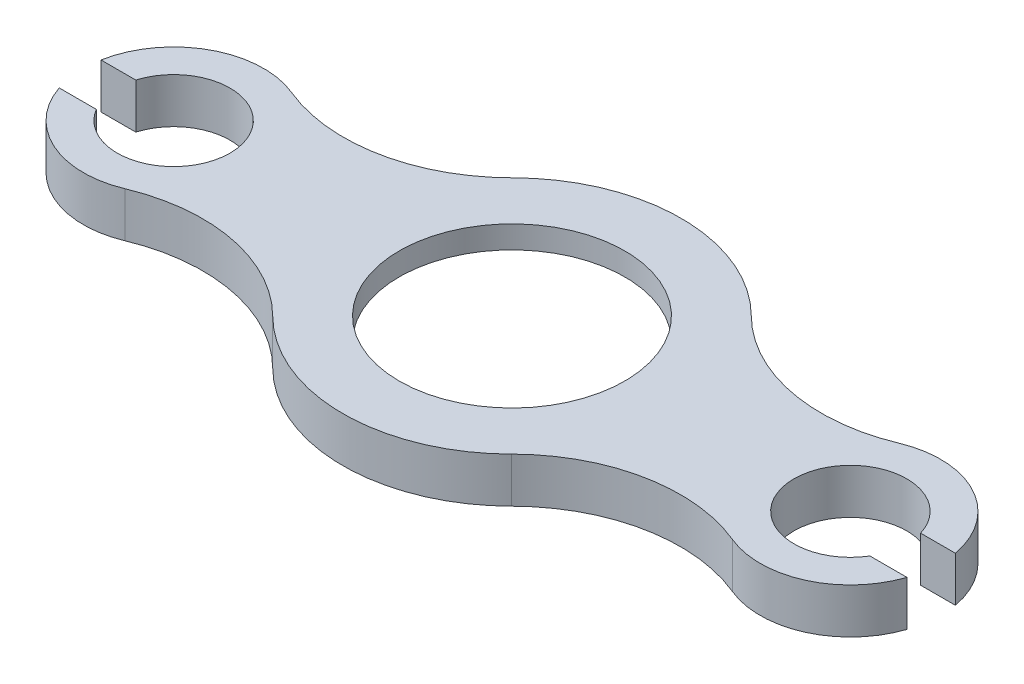
ISO-10303-21;
HEADER;
FILE_DESCRIPTION(('STEP AP214'),'2;1');
FILE_NAME('part.step','',(''),(''),'','','');
FILE_SCHEMA(('AUTOMOTIVE_DESIGN { 1 0 10303 214 1 1 1 1 }'));
ENDSEC;
DATA;
#1=APPLICATION_CONTEXT('core data for automotive mechanical design processes');
#2=APPLICATION_PROTOCOL_DEFINITION('international standard','automotive_design',2000,#1);
#3=PRODUCT_CONTEXT('',#1,'mechanical');
#4=PRODUCT('Part','Part','',(#3));
#5=PRODUCT_RELATED_PRODUCT_CATEGORY('part','',(#4));
#6=PRODUCT_DEFINITION_FORMATION('','',#4);
#7=PRODUCT_DEFINITION_CONTEXT('part definition',#1,'design');
#8=PRODUCT_DEFINITION('design','',#6,#7);
#9=PRODUCT_DEFINITION_SHAPE('','',#8);
#10=(LENGTH_UNIT() NAMED_UNIT(*) SI_UNIT(.MILLI.,.METRE.));
#11=(NAMED_UNIT(*) PLANE_ANGLE_UNIT() SI_UNIT($,.RADIAN.));
#12=(NAMED_UNIT(*) SI_UNIT($,.STERADIAN.) SOLID_ANGLE_UNIT());
#13=UNCERTAINTY_MEASURE_WITH_UNIT(LENGTH_MEASURE(1.E-05),#10,'distance_accuracy_value','');
#14=(GEOMETRIC_REPRESENTATION_CONTEXT(3) GLOBAL_UNCERTAINTY_ASSIGNED_CONTEXT((#13)) GLOBAL_UNIT_ASSIGNED_CONTEXT((#10,
#11,#12)) REPRESENTATION_CONTEXT('',''));
#15=CARTESIAN_POINT('',(0.,0.,0.));
#16=DIRECTION('',(0.,0.,1.));
#17=DIRECTION('',(1.,0.,0.));
#18=AXIS2_PLACEMENT_3D('',#15,#16,#17);
#19=CARTESIAN_POINT('',(150.,20.,0.));
#20=DIRECTION('',(0.,-1.,0.));
#21=DIRECTION('',(0.,0.,-1.));
#22=AXIS2_PLACEMENT_3D('',#19,#20,#21);
#23=CYLINDRICAL_SURFACE('',#22,40.);
#24=CARTESIAN_POINT('',(150.,20.,0.));
#25=DIRECTION('',(0.,1.,0.));
#26=DIRECTION('',(0.,0.,1.));
#27=AXIS2_PLACEMENT_3D('',#24,#25,#26);
#28=CIRCLE('',#27,40.);
#29=CARTESIAN_POINT('',(189.349681891084,20.,-7.18349045175815));
#30=VERTEX_POINT('',#29);
#31=CARTESIAN_POINT('',(134.666666666667,20.,-36.9444026733264));
#32=VERTEX_POINT('',#31);
#33=EDGE_CURVE('E289',#30,#32,#28,.T.);
#34=ORIENTED_EDGE('',*,*,#33,.F.);
#35=DIRECTION('',(0.,-1.,0.));
#36=VECTOR('',#35,1.);
#37=CARTESIAN_POINT('',(189.349681891084,20.,-7.18349045175815));
#38=LINE('',#37,#36);
#39=CARTESIAN_POINT('',(189.349681891084,0.,-7.18349045175815));
#40=VERTEX_POINT('',#39);
#41=EDGE_CURVE('E382',#30,#40,#38,.T.);
#42=ORIENTED_EDGE('',*,*,#41,.T.);
#43=CARTESIAN_POINT('',(150.,0.,0.));
#44=DIRECTION('',(0.,1.,0.));
#45=DIRECTION('',(0.,0.,1.));
#46=AXIS2_PLACEMENT_3D('',#43,#44,#45);
#47=CIRCLE('',#46,40.);
#48=CARTESIAN_POINT('',(134.666666666667,0.,-36.9444026733264));
#49=VERTEX_POINT('',#48);
#50=EDGE_CURVE('E313',#40,#49,#47,.T.);
#51=ORIENTED_EDGE('',*,*,#50,.T.);
#52=DIRECTION('',(0.,-1.,0.));
#53=VECTOR('',#52,1.);
#54=CARTESIAN_POINT('',(134.666666666667,20.,-36.9444026733264));
#55=LINE('',#54,#53);
#56=EDGE_CURVE('E345',#32,#49,#55,.T.);
#57=ORIENTED_EDGE('',*,*,#56,.F.);
#58=EDGE_LOOP('',(#34,#42,#51,#57));
#59=FACE_BOUND('',#58,.T.);
#60=ADVANCED_FACE('F128',(#59),#23,.T.);
#61=CARTESIAN_POINT('',(-150.,20.,0.));
#62=DIRECTION('',(0.,-1.,0.));
#63=DIRECTION('',(0.,0.,-1.));
#64=AXIS2_PLACEMENT_3D('',#61,#62,#63);
#65=CYLINDRICAL_SURFACE('',#64,40.);
#66=CARTESIAN_POINT('',(-150.,0.,0.));
#67=DIRECTION('',(0.,1.,0.));
#68=DIRECTION('',(0.,0.,1.));
#69=AXIS2_PLACEMENT_3D('',#66,#67,#68);
#70=CIRCLE('',#69,40.);
#71=CARTESIAN_POINT('',(-134.666666666667,0.,-36.9444026733264));
#72=VERTEX_POINT('',#71);
#73=CARTESIAN_POINT('',(-189.349681891084,0.,-7.18349045175815));
#74=VERTEX_POINT('',#73);
#75=EDGE_CURVE('E324',#72,#74,#70,.T.);
#76=ORIENTED_EDGE('',*,*,#75,.T.);
#77=DIRECTION('',(0.,-1.,0.));
#78=VECTOR('',#77,1.);
#79=CARTESIAN_POINT('',(-189.349681891084,20.,-7.18349045175815));
#80=LINE('',#79,#78);
#81=CARTESIAN_POINT('',(-189.349681891084,20.,-7.18349045175815));
#82=VERTEX_POINT('',#81);
#83=EDGE_CURVE('E361',#74,#82,#80,.F.);
#84=ORIENTED_EDGE('',*,*,#83,.T.);
#85=CARTESIAN_POINT('',(-150.,20.,0.));
#86=DIRECTION('',(0.,1.,0.));
#87=DIRECTION('',(0.,0.,1.));
#88=AXIS2_PLACEMENT_3D('',#85,#86,#87);
#89=CIRCLE('',#88,40.);
#90=CARTESIAN_POINT('',(-134.666666666667,20.,-36.9444026733264));
#91=VERTEX_POINT('',#90);
#92=EDGE_CURVE('E302',#91,#82,#89,.T.);
#93=ORIENTED_EDGE('',*,*,#92,.F.);
#94=DIRECTION('',(0.,-1.,0.));
#95=VECTOR('',#94,1.);
#96=CARTESIAN_POINT('',(-134.666666666667,20.,-36.9444026733264));
#97=LINE('',#96,#95);
#98=EDGE_CURVE('E337',#91,#72,#97,.T.);
#99=ORIENTED_EDGE('',*,*,#98,.T.);
#100=EDGE_LOOP('',(#76,#84,#93,#99));
#101=FACE_BOUND('',#100,.T.);
#102=ADVANCED_FACE('F402',(#101),#65,.T.);
#103=CARTESIAN_POINT('',(127.958333333333,20.,53.1075788429067));
#104=DIRECTION('',(0.,-1.,0.));
#105=DIRECTION('',(0.,0.,-1.));
#106=AXIS2_PLACEMENT_3D('',#103,#104,#105);
#107=PLANE('',#106);
#108=CARTESIAN_POINT('',(150.,20.,0.));
#109=DIRECTION('',(0.,1.,0.));
#110=DIRECTION('',(0.,0.,1.));
#111=AXIS2_PLACEMENT_3D('',#108,#109,#110);
#112=CIRCLE('',#111,25.);
#113=CARTESIAN_POINT('',(173.945719135777,20.,-7.18349045175815));
#114=VERTEX_POINT('',#113);
#115=CARTESIAN_POINT('',(171.464787047624,20.,12.8165095482419));
#116=VERTEX_POINT('',#115);
#117=EDGE_CURVE('E277',#114,#116,#112,.T.);
#118=ORIENTED_EDGE('',*,*,#117,.F.);
#119=DIRECTION('',(1.,0.,0.));
#120=VECTOR('',#119,1.);
#121=CARTESIAN_POINT('',(127.958333333333,20.,-7.18349045175815));
#122=LINE('',#121,#120);
#123=EDGE_CURVE('E150',#114,#30,#122,.T.);
#124=ORIENTED_EDGE('',*,*,#123,.T.);
#125=ORIENTED_EDGE('',*,*,#33,.T.);
#126=CARTESIAN_POINT('',(105.916666666667,20.,-106.215157685813));
#127=DIRECTION('',(0.,1.,0.));
#128=DIRECTION('',(0.,0.,1.));
#129=AXIS2_PLACEMENT_3D('',#126,#127,#128);
#130=CIRCLE('',#129,75.);
#131=CARTESIAN_POINT('',(52.9583333333333,20.,-53.1075788429067));
#132=VERTEX_POINT('',#131);
#133=EDGE_CURVE('E294',#132,#32,#130,.T.);
#134=ORIENTED_EDGE('',*,*,#133,.F.);
#135=CARTESIAN_POINT('',(0.,20.,0.));
#136=DIRECTION('',(0.,1.,0.));
#137=DIRECTION('',(0.,0.,1.));
#138=AXIS2_PLACEMENT_3D('',#135,#136,#137);
#139=CIRCLE('',#138,75.);
#140=CARTESIAN_POINT('',(-52.9583333333333,20.,-53.1075788429068));
#141=VERTEX_POINT('',#140);
#142=EDGE_CURVE('E297',#132,#141,#139,.T.);
#143=ORIENTED_EDGE('',*,*,#142,.T.);
#144=CARTESIAN_POINT('',(-105.916666666667,20.,-106.215157685813));
#145=DIRECTION('',(0.,-1.,0.));
#146=DIRECTION('',(0.,0.,-1.));
#147=AXIS2_PLACEMENT_3D('',#144,#145,#146);
#148=CIRCLE('',#147,75.);
#149=EDGE_CURVE('E299',#141,#91,#148,.T.);
#150=ORIENTED_EDGE('',*,*,#149,.T.);
#151=ORIENTED_EDGE('',*,*,#92,.T.);
#152=DIRECTION('',(1.,0.,0.));
#153=VECTOR('',#152,1.);
#154=CARTESIAN_POINT('',(127.958333333333,20.,-7.18349045175815));
#155=LINE('',#154,#153);
#156=CARTESIAN_POINT('',(-173.945719135777,20.,-7.18349045175815));
#157=VERTEX_POINT('',#156);
#158=EDGE_CURVE('E375',#82,#157,#155,.T.);
#159=ORIENTED_EDGE('',*,*,#158,.T.);
#160=CARTESIAN_POINT('',(-150.,20.,0.));
#161=DIRECTION('',(0.,-1.,0.));
#162=DIRECTION('',(0.,0.,-1.));
#163=AXIS2_PLACEMENT_3D('',#160,#161,#162);
#164=CIRCLE('',#163,25.);
#165=CARTESIAN_POINT('',(-171.464787047624,20.,12.8165095482419));
#166=VERTEX_POINT('',#165);
#167=EDGE_CURVE('E267',#157,#166,#164,.T.);
#168=ORIENTED_EDGE('',*,*,#167,.T.);
#169=DIRECTION('',(-1.,0.,0.));
#170=VECTOR('',#169,1.);
#171=CARTESIAN_POINT('',(127.958333333333,20.,12.8165095482419));
#172=LINE('',#171,#170);
#173=CARTESIAN_POINT('',(-187.891121427055,20.,12.8165095482419));
#174=VERTEX_POINT('',#173);
#175=EDGE_CURVE('E245',#166,#174,#172,.T.);
#176=ORIENTED_EDGE('',*,*,#175,.T.);
#177=CARTESIAN_POINT('',(-134.666666666666,20.,36.9444026733264));
#178=VERTEX_POINT('',#177);
#179=EDGE_CURVE('E301',#174,#178,#89,.T.);
#180=ORIENTED_EDGE('',*,*,#179,.T.);
#181=CARTESIAN_POINT('',(-105.916666666666,20.,106.215157685813));
#182=DIRECTION('',(0.,1.,0.));
#183=DIRECTION('',(0.,0.,1.));
#184=AXIS2_PLACEMENT_3D('',#181,#182,#183);
#185=CIRCLE('',#184,75.);
#186=CARTESIAN_POINT('',(-52.9583333333331,20.,53.1075788429067));
#187=VERTEX_POINT('',#186);
#188=EDGE_CURVE('E305',#187,#178,#185,.T.);
#189=ORIENTED_EDGE('',*,*,#188,.F.);
#190=CARTESIAN_POINT('',(0.,20.,0.));
#191=DIRECTION('',(0.,1.,0.));
#192=DIRECTION('',(0.,0.,1.));
#193=AXIS2_PLACEMENT_3D('',#190,#191,#192);
#194=CIRCLE('',#193,74.9999999999998);
#195=CARTESIAN_POINT('',(52.9583333333331,20.,53.1075788429067));
#196=VERTEX_POINT('',#195);
#197=EDGE_CURVE('E308',#187,#196,#194,.T.);
#198=ORIENTED_EDGE('',*,*,#197,.T.);
#199=CARTESIAN_POINT('',(105.916666666666,20.,106.215157685813));
#200=DIRECTION('',(0.,-1.,0.));
#201=DIRECTION('',(0.,0.,-1.));
#202=AXIS2_PLACEMENT_3D('',#199,#200,#201);
#203=CIRCLE('',#202,75.);
#204=CARTESIAN_POINT('',(134.666666666666,20.,36.9444026733264));
#205=VERTEX_POINT('',#204);
#206=EDGE_CURVE('E286',#196,#205,#203,.T.);
#207=ORIENTED_EDGE('',*,*,#206,.T.);
#208=CARTESIAN_POINT('',(187.891121427055,20.,12.8165095482419));
#209=VERTEX_POINT('',#208);
#210=EDGE_CURVE('E291',#205,#209,#28,.T.);
#211=ORIENTED_EDGE('',*,*,#210,.T.);
#212=DIRECTION('',(-1.,0.,0.));
#213=VECTOR('',#212,1.);
#214=CARTESIAN_POINT('',(127.958333333333,20.,12.8165095482419));
#215=LINE('',#214,#213);
#216=EDGE_CURVE('E352',#209,#116,#215,.T.);
#217=ORIENTED_EDGE('',*,*,#216,.T.);
#218=EDGE_LOOP('',(#118,#124,#125,#134,#143,#150,#151,#159,#168,#176,#180,#189,#198,#207,#211,#217));
#219=FACE_BOUND('',#218,.T.);
#220=CARTESIAN_POINT('',(0.,20.,0.));
#221=DIRECTION('',(0.,1.,0.));
#222=DIRECTION('',(0.,0.,1.));
#223=AXIS2_PLACEMENT_3D('',#220,#221,#222);
#224=CIRCLE('',#223,50.);
#225=CARTESIAN_POINT('',(0.,20.,50.));
#226=VERTEX_POINT('',#225);
#227=EDGE_CURVE('E280',#226,#226,#224,.T.);
#228=ORIENTED_EDGE('',*,*,#227,.F.);
#229=EDGE_LOOP('',(#228));
#230=FACE_BOUND('',#229,.T.);
#231=ADVANCED_FACE('F358',(#219,#230),#107,.F.);
#232=CARTESIAN_POINT('',(127.958333333333,0.,53.1075788429067));
#233=DIRECTION('',(0.,-1.,0.));
#234=DIRECTION('',(0.,0.,-1.));
#235=AXIS2_PLACEMENT_3D('',#232,#233,#234);
#236=PLANE('',#235);
#237=DIRECTION('',(1.,0.,0.));
#238=VECTOR('',#237,1.);
#239=CARTESIAN_POINT('',(170.689370017687,0.,-7.18349045175815));
#240=LINE('',#239,#238);
#241=CARTESIAN_POINT('',(173.945719135777,0.,-7.18349045175815));
#242=VERTEX_POINT('',#241);
#243=EDGE_CURVE('E365',#242,#40,#240,.T.);
#244=ORIENTED_EDGE('',*,*,#243,.F.);
#245=CARTESIAN_POINT('',(150.,0.,0.));
#246=DIRECTION('',(0.,1.,0.));
#247=DIRECTION('',(0.,0.,1.));
#248=AXIS2_PLACEMENT_3D('',#245,#246,#247);
#249=CIRCLE('',#248,25.);
#250=CARTESIAN_POINT('',(171.464787047624,0.,12.8165095482419));
#251=VERTEX_POINT('',#250);
#252=EDGE_CURVE('E270',#242,#251,#249,.T.);
#253=ORIENTED_EDGE('',*,*,#252,.T.);
#254=DIRECTION('',(-1.,0.,0.));
#255=VECTOR('',#254,1.);
#256=CARTESIAN_POINT('',(170.689370017687,0.,12.8165095482419));
#257=LINE('',#256,#255);
#258=CARTESIAN_POINT('',(187.891121427055,0.,12.8165095482419));
#259=VERTEX_POINT('',#258);
#260=EDGE_CURVE('E143',#259,#251,#257,.T.);
#261=ORIENTED_EDGE('',*,*,#260,.F.);
#262=CARTESIAN_POINT('',(134.666666666666,0.,36.9444026733264));
#263=VERTEX_POINT('',#262);
#264=EDGE_CURVE('E314',#263,#259,#47,.T.);
#265=ORIENTED_EDGE('',*,*,#264,.F.);
#266=CARTESIAN_POINT('',(105.916666666666,0.,106.215157685813));
#267=DIRECTION('',(0.,-1.,0.));
#268=DIRECTION('',(0.,0.,-1.));
#269=AXIS2_PLACEMENT_3D('',#266,#267,#268);
#270=CIRCLE('',#269,75.);
#271=CARTESIAN_POINT('',(52.9583333333331,0.,53.1075788429067));
#272=VERTEX_POINT('',#271);
#273=EDGE_CURVE('E285',#272,#263,#270,.T.);
#274=ORIENTED_EDGE('',*,*,#273,.F.);
#275=CARTESIAN_POINT('',(0.,0.,0.));
#276=DIRECTION('',(0.,1.,0.));
#277=DIRECTION('',(0.,0.,1.));
#278=AXIS2_PLACEMENT_3D('',#275,#276,#277);
#279=CIRCLE('',#278,74.9999999999998);
#280=CARTESIAN_POINT('',(-52.9583333333331,0.,53.1075788429067));
#281=VERTEX_POINT('',#280);
#282=EDGE_CURVE('E290',#281,#272,#279,.T.);
#283=ORIENTED_EDGE('',*,*,#282,.F.);
#284=CARTESIAN_POINT('',(-105.916666666666,0.,106.215157685813));
#285=DIRECTION('',(0.,1.,0.));
#286=DIRECTION('',(0.,0.,1.));
#287=AXIS2_PLACEMENT_3D('',#284,#285,#286);
#288=CIRCLE('',#287,75.);
#289=CARTESIAN_POINT('',(-134.666666666666,0.,36.9444026733264));
#290=VERTEX_POINT('',#289);
#291=EDGE_CURVE('E327',#281,#290,#288,.T.);
#292=ORIENTED_EDGE('',*,*,#291,.T.);
#293=CARTESIAN_POINT('',(-187.891121427055,0.,12.8165095482419));
#294=VERTEX_POINT('',#293);
#295=EDGE_CURVE('E262',#294,#290,#70,.T.);
#296=ORIENTED_EDGE('',*,*,#295,.F.);
#297=DIRECTION('',(-1.,0.,0.));
#298=VECTOR('',#297,1.);
#299=CARTESIAN_POINT('',(-170.689370017687,0.,12.8165095482419));
#300=LINE('',#299,#298);
#301=CARTESIAN_POINT('',(-171.464787047624,0.,12.8165095482419));
#302=VERTEX_POINT('',#301);
#303=EDGE_CURVE('E242',#302,#294,#300,.T.);
#304=ORIENTED_EDGE('',*,*,#303,.F.);
#305=CARTESIAN_POINT('',(-150.,0.,0.));
#306=DIRECTION('',(0.,-1.,0.));
#307=DIRECTION('',(0.,0.,-1.));
#308=AXIS2_PLACEMENT_3D('',#305,#306,#307);
#309=CIRCLE('',#308,25.);
#310=CARTESIAN_POINT('',(-173.945719135777,0.,-7.18349045175815));
#311=VERTEX_POINT('',#310);
#312=EDGE_CURVE('E260',#311,#302,#309,.T.);
#313=ORIENTED_EDGE('',*,*,#312,.F.);
#314=DIRECTION('',(1.,0.,0.));
#315=VECTOR('',#314,1.);
#316=CARTESIAN_POINT('',(-170.689370017687,0.,-7.18349045175815));
#317=LINE('',#316,#315);
#318=EDGE_CURVE('E263',#74,#311,#317,.T.);
#319=ORIENTED_EDGE('',*,*,#318,.F.);
#320=ORIENTED_EDGE('',*,*,#75,.F.);
#321=CARTESIAN_POINT('',(-105.916666666667,0.,-106.215157685813));
#322=DIRECTION('',(0.,-1.,0.));
#323=DIRECTION('',(0.,0.,-1.));
#324=AXIS2_PLACEMENT_3D('',#321,#322,#323);
#325=CIRCLE('',#324,75.);
#326=CARTESIAN_POINT('',(-52.9583333333333,0.,-53.1075788429068));
#327=VERTEX_POINT('',#326);
#328=EDGE_CURVE('E322',#327,#72,#325,.T.);
#329=ORIENTED_EDGE('',*,*,#328,.F.);
#330=CARTESIAN_POINT('',(0.,0.,0.));
#331=DIRECTION('',(0.,1.,0.));
#332=DIRECTION('',(0.,0.,1.));
#333=AXIS2_PLACEMENT_3D('',#330,#331,#332);
#334=CIRCLE('',#333,75.);
#335=CARTESIAN_POINT('',(52.9583333333333,0.,-53.1075788429067));
#336=VERTEX_POINT('',#335);
#337=EDGE_CURVE('E320',#336,#327,#334,.T.);
#338=ORIENTED_EDGE('',*,*,#337,.F.);
#339=CARTESIAN_POINT('',(105.916666666667,0.,-106.215157685813));
#340=DIRECTION('',(0.,1.,0.));
#341=DIRECTION('',(0.,0.,1.));
#342=AXIS2_PLACEMENT_3D('',#339,#340,#341);
#343=CIRCLE('',#342,75.);
#344=EDGE_CURVE('E317',#336,#49,#343,.T.);
#345=ORIENTED_EDGE('',*,*,#344,.T.);
#346=ORIENTED_EDGE('',*,*,#50,.F.);
#347=EDGE_LOOP('',(#244,#253,#261,#265,#274,#283,#292,#296,#304,#313,#319,#320,#329,#338,#345,#346));
#348=FACE_BOUND('',#347,.T.);
#349=CARTESIAN_POINT('',(0.,0.,0.));
#350=DIRECTION('',(0.,1.,0.));
#351=DIRECTION('',(0.,0.,1.));
#352=AXIS2_PLACEMENT_3D('',#349,#350,#351);
#353=CIRCLE('',#352,67.8);
#354=CARTESIAN_POINT('',(0.,0.,67.8));
#355=VERTEX_POINT('',#354);
#356=EDGE_CURVE('E384',#355,#355,#353,.T.);
#357=ORIENTED_EDGE('',*,*,#356,.T.);
#358=EDGE_LOOP('',(#357));
#359=FACE_BOUND('',#358,.T.);
#360=ADVANCED_FACE('F257',(#348,#359),#236,.T.);
#361=CARTESIAN_POINT('',(105.916666666666,20.,106.215157685813));
#362=DIRECTION('',(0.,-1.,0.));
#363=DIRECTION('',(0.,0.,-1.));
#364=AXIS2_PLACEMENT_3D('',#361,#362,#363);
#365=CYLINDRICAL_SURFACE('',#364,75.);
#366=ORIENTED_EDGE('',*,*,#273,.T.);
#367=DIRECTION('',(0.,-1.,0.));
#368=VECTOR('',#367,1.);
#369=CARTESIAN_POINT('',(134.666666666666,20.,36.9444026733264));
#370=LINE('',#369,#368);
#371=EDGE_CURVE('E251',#205,#263,#370,.T.);
#372=ORIENTED_EDGE('',*,*,#371,.F.);
#373=ORIENTED_EDGE('',*,*,#206,.F.);
#374=DIRECTION('',(0.,-1.,0.));
#375=VECTOR('',#374,1.);
#376=CARTESIAN_POINT('',(52.9583333333331,20.,53.1075788429067));
#377=LINE('',#376,#375);
#378=EDGE_CURVE('E310',#196,#272,#377,.T.);
#379=ORIENTED_EDGE('',*,*,#378,.T.);
#380=EDGE_LOOP('',(#366,#372,#373,#379));
#381=FACE_BOUND('',#380,.T.);
#382=ADVANCED_FACE('F130',(#381),#365,.F.);
#383=ORIENTED_EDGE('',*,*,#264,.T.);
#384=DIRECTION('',(0.,-1.,0.));
#385=VECTOR('',#384,1.);
#386=CARTESIAN_POINT('',(187.891121427055,20.,12.8165095482419));
#387=LINE('',#386,#385);
#388=EDGE_CURVE('E360',#259,#209,#387,.F.);
#389=ORIENTED_EDGE('',*,*,#388,.T.);
#390=ORIENTED_EDGE('',*,*,#210,.F.);
#391=ORIENTED_EDGE('',*,*,#371,.T.);
#392=EDGE_LOOP('',(#383,#389,#390,#391));
#393=FACE_BOUND('',#392,.T.);
#394=ADVANCED_FACE('F404',(#393),#23,.T.);
#395=CARTESIAN_POINT('',(105.916666666667,20.,-106.215157685813));
#396=DIRECTION('',(0.,-1.,0.));
#397=DIRECTION('',(0.,0.,-1.));
#398=AXIS2_PLACEMENT_3D('',#395,#396,#397);
#399=CYLINDRICAL_SURFACE('',#398,75.);
#400=ORIENTED_EDGE('',*,*,#344,.F.);
#401=DIRECTION('',(0.,-1.,0.));
#402=VECTOR('',#401,1.);
#403=CARTESIAN_POINT('',(52.9583333333333,20.,-53.1075788429067));
#404=LINE('',#403,#402);
#405=EDGE_CURVE('E343',#132,#336,#404,.T.);
#406=ORIENTED_EDGE('',*,*,#405,.F.);
#407=ORIENTED_EDGE('',*,*,#133,.T.);
#408=ORIENTED_EDGE('',*,*,#56,.T.);
#409=EDGE_LOOP('',(#400,#406,#407,#408));
#410=FACE_BOUND('',#409,.T.);
#411=ADVANCED_FACE('F415',(#410),#399,.F.);
#412=CARTESIAN_POINT('',(0.,20.,0.));
#413=DIRECTION('',(0.,-1.,0.));
#414=DIRECTION('',(0.,0.,-1.));
#415=AXIS2_PLACEMENT_3D('',#412,#413,#414);
#416=CYLINDRICAL_SURFACE('',#415,75.);
#417=ORIENTED_EDGE('',*,*,#337,.T.);
#418=DIRECTION('',(0.,-1.,0.));
#419=VECTOR('',#418,1.);
#420=CARTESIAN_POINT('',(-52.9583333333333,20.,-53.1075788429068));
#421=LINE('',#420,#419);
#422=EDGE_CURVE('E340',#141,#327,#421,.T.);
#423=ORIENTED_EDGE('',*,*,#422,.F.);
#424=ORIENTED_EDGE('',*,*,#142,.F.);
#425=ORIENTED_EDGE('',*,*,#405,.T.);
#426=EDGE_LOOP('',(#417,#423,#424,#425));
#427=FACE_BOUND('',#426,.T.);
#428=ADVANCED_FACE('F422',(#427),#416,.T.);
#429=CARTESIAN_POINT('',(-105.916666666667,20.,-106.215157685813));
#430=DIRECTION('',(0.,-1.,0.));
#431=DIRECTION('',(0.,0.,-1.));
#432=AXIS2_PLACEMENT_3D('',#429,#430,#431);
#433=CYLINDRICAL_SURFACE('',#432,75.);
#434=ORIENTED_EDGE('',*,*,#328,.T.);
#435=ORIENTED_EDGE('',*,*,#98,.F.);
#436=ORIENTED_EDGE('',*,*,#149,.F.);
#437=ORIENTED_EDGE('',*,*,#422,.T.);
#438=EDGE_LOOP('',(#434,#435,#436,#437));
#439=FACE_BOUND('',#438,.T.);
#440=ADVANCED_FACE('F450',(#439),#433,.F.);
#441=ORIENTED_EDGE('',*,*,#179,.F.);
#442=DIRECTION('',(0.,-1.,0.));
#443=VECTOR('',#442,1.);
#444=CARTESIAN_POINT('',(-187.891121427055,20.,12.8165095482419));
#445=LINE('',#444,#443);
#446=EDGE_CURVE('E369',#174,#294,#445,.T.);
#447=ORIENTED_EDGE('',*,*,#446,.T.);
#448=ORIENTED_EDGE('',*,*,#295,.T.);
#449=DIRECTION('',(0.,-1.,0.));
#450=VECTOR('',#449,1.);
#451=CARTESIAN_POINT('',(-134.666666666666,20.,36.9444026733264));
#452=LINE('',#451,#450);
#453=EDGE_CURVE('E334',#178,#290,#452,.T.);
#454=ORIENTED_EDGE('',*,*,#453,.F.);
#455=EDGE_LOOP('',(#441,#447,#448,#454));
#456=FACE_BOUND('',#455,.T.);
#457=ADVANCED_FACE('F411',(#456),#65,.T.);
#458=CARTESIAN_POINT('',(-105.916666666666,20.,106.215157685813));
#459=DIRECTION('',(0.,-1.,0.));
#460=DIRECTION('',(0.,0.,-1.));
#461=AXIS2_PLACEMENT_3D('',#458,#459,#460);
#462=CYLINDRICAL_SURFACE('',#461,75.);
#463=ORIENTED_EDGE('',*,*,#291,.F.);
#464=DIRECTION('',(0.,-1.,0.));
#465=VECTOR('',#464,1.);
#466=CARTESIAN_POINT('',(-52.9583333333331,20.,53.1075788429067));
#467=LINE('',#466,#465);
#468=EDGE_CURVE('E332',#187,#281,#467,.T.);
#469=ORIENTED_EDGE('',*,*,#468,.F.);
#470=ORIENTED_EDGE('',*,*,#188,.T.);
#471=ORIENTED_EDGE('',*,*,#453,.T.);
#472=EDGE_LOOP('',(#463,#469,#470,#471));
#473=FACE_BOUND('',#472,.T.);
#474=ADVANCED_FACE('F437',(#473),#462,.F.);
#475=CARTESIAN_POINT('',(0.,20.,0.));
#476=DIRECTION('',(0.,-1.,0.));
#477=DIRECTION('',(0.,0.,-1.));
#478=AXIS2_PLACEMENT_3D('',#475,#476,#477);
#479=CYLINDRICAL_SURFACE('',#478,74.9999999999998);
#480=ORIENTED_EDGE('',*,*,#282,.T.);
#481=ORIENTED_EDGE('',*,*,#378,.F.);
#482=ORIENTED_EDGE('',*,*,#197,.F.);
#483=ORIENTED_EDGE('',*,*,#468,.T.);
#484=EDGE_LOOP('',(#480,#481,#482,#483));
#485=FACE_BOUND('',#484,.T.);
#486=ADVANCED_FACE('F434',(#485),#479,.T.);
#487=CARTESIAN_POINT('',(0.,20.,0.));
#488=DIRECTION('',(0.,-1.,0.));
#489=DIRECTION('',(0.,0.,-1.));
#490=AXIS2_PLACEMENT_3D('',#487,#488,#489);
#491=CYLINDRICAL_SURFACE('',#490,50.);
#492=CARTESIAN_POINT('',(0.,10.,0.));
#493=DIRECTION('',(0.,1.,0.));
#494=DIRECTION('',(0.,0.,1.));
#495=AXIS2_PLACEMENT_3D('',#492,#493,#494);
#496=CIRCLE('',#495,50.);
#497=CARTESIAN_POINT('',(0.,10.,50.));
#498=VERTEX_POINT('',#497);
#499=EDGE_CURVE('E268',#498,#498,#496,.T.);
#500=ORIENTED_EDGE('',*,*,#499,.F.);
#501=EDGE_LOOP('',(#500));
#502=FACE_BOUND('',#501,.T.);
#503=ORIENTED_EDGE('',*,*,#227,.T.);
#504=EDGE_LOOP('',(#503));
#505=FACE_BOUND('',#504,.T.);
#506=ADVANCED_FACE('F468',(#502,#505),#491,.F.);
#507=CARTESIAN_POINT('',(150.,20.,0.));
#508=DIRECTION('',(0.,-1.,0.));
#509=DIRECTION('',(0.,0.,-1.));
#510=AXIS2_PLACEMENT_3D('',#507,#508,#509);
#511=CYLINDRICAL_SURFACE('',#510,25.);
#512=DIRECTION('',(0.,-1.,0.));
#513=VECTOR('',#512,1.);
#514=CARTESIAN_POINT('',(173.945719135777,20.,-7.18349045175815));
#515=LINE('',#514,#513);
#516=EDGE_CURVE('E12',#114,#242,#515,.T.);
#517=ORIENTED_EDGE('',*,*,#516,.F.);
#518=ORIENTED_EDGE('',*,*,#117,.T.);
#519=DIRECTION('',(0.,-1.,0.));
#520=VECTOR('',#519,1.);
#521=CARTESIAN_POINT('',(171.464787047624,20.,12.8165095482419));
#522=LINE('',#521,#520);
#523=EDGE_CURVE('E136',#251,#116,#522,.F.);
#524=ORIENTED_EDGE('',*,*,#523,.F.);
#525=ORIENTED_EDGE('',*,*,#252,.F.);
#526=EDGE_LOOP('',(#517,#518,#524,#525));
#527=FACE_BOUND('',#526,.T.);
#528=ADVANCED_FACE('F363',(#527),#511,.F.);
#529=CARTESIAN_POINT('',(-150.,20.,0.));
#530=DIRECTION('',(0.,-1.,0.));
#531=DIRECTION('',(0.,0.,-1.));
#532=AXIS2_PLACEMENT_3D('',#529,#530,#531);
#533=CYLINDRICAL_SURFACE('',#532,25.);
#534=ORIENTED_EDGE('',*,*,#167,.F.);
#535=DIRECTION('',(0.,-1.,0.));
#536=VECTOR('',#535,1.);
#537=CARTESIAN_POINT('',(-173.945719135777,20.,-7.18349045175815));
#538=LINE('',#537,#536);
#539=EDGE_CURVE('E250',#157,#311,#538,.T.);
#540=ORIENTED_EDGE('',*,*,#539,.T.);
#541=ORIENTED_EDGE('',*,*,#312,.T.);
#542=DIRECTION('',(0.,-1.,0.));
#543=VECTOR('',#542,1.);
#544=CARTESIAN_POINT('',(-171.464787047624,20.,12.8165095482419));
#545=LINE('',#544,#543);
#546=EDGE_CURVE('E239',#302,#166,#545,.F.);
#547=ORIENTED_EDGE('',*,*,#546,.T.);
#548=EDGE_LOOP('',(#534,#540,#541,#547));
#549=FACE_BOUND('',#548,.T.);
#550=ADVANCED_FACE('F266',(#549),#533,.F.);
#551=CARTESIAN_POINT('',(0.,10.,0.));
#552=DIRECTION('',(0.,-1.,0.));
#553=DIRECTION('',(0.,0.,-1.));
#554=AXIS2_PLACEMENT_3D('',#551,#552,#553);
#555=CYLINDRICAL_SURFACE('',#554,67.8);
#556=CARTESIAN_POINT('',(0.,10.,0.));
#557=DIRECTION('',(0.,1.,0.));
#558=DIRECTION('',(0.,0.,1.));
#559=AXIS2_PLACEMENT_3D('',#556,#557,#558);
#560=CIRCLE('',#559,67.8);
#561=CARTESIAN_POINT('',(0.,10.,67.8));
#562=VERTEX_POINT('',#561);
#563=EDGE_CURVE('E273',#562,#562,#560,.T.);
#564=ORIENTED_EDGE('',*,*,#563,.T.);
#565=EDGE_LOOP('',(#564));
#566=FACE_BOUND('',#565,.T.);
#567=ORIENTED_EDGE('',*,*,#356,.F.);
#568=EDGE_LOOP('',(#567));
#569=FACE_BOUND('',#568,.T.);
#570=ADVANCED_FACE('F389',(#566,#569),#555,.F.);
#571=CARTESIAN_POINT('',(0.,10.,0.));
#572=DIRECTION('',(0.,1.,0.));
#573=DIRECTION('',(0.,0.,1.));
#574=AXIS2_PLACEMENT_3D('',#571,#572,#573);
#575=PLANE('',#574);
#576=ORIENTED_EDGE('',*,*,#499,.T.);
#577=EDGE_LOOP('',(#576));
#578=FACE_BOUND('',#577,.T.);
#579=ORIENTED_EDGE('',*,*,#563,.F.);
#580=EDGE_LOOP('',(#579));
#581=FACE_BOUND('',#580,.T.);
#582=ADVANCED_FACE('F391',(#578,#581),#575,.F.);
#583=CARTESIAN_POINT('',(-170.689370017687,30.,12.8165095482419));
#584=DIRECTION('',(0.,0.,1.));
#585=DIRECTION('',(1.,0.,0.));
#586=AXIS2_PLACEMENT_3D('',#583,#584,#585);
#587=PLANE('',#586);
#588=ORIENTED_EDGE('',*,*,#175,.F.);
#589=ORIENTED_EDGE('',*,*,#546,.F.);
#590=ORIENTED_EDGE('',*,*,#303,.T.);
#591=ORIENTED_EDGE('',*,*,#446,.F.);
#592=EDGE_LOOP('',(#588,#589,#590,#591));
#593=FACE_BOUND('',#592,.T.);
#594=ADVANCED_FACE('F241',(#593),#587,.F.);
#595=CARTESIAN_POINT('',(-170.689370017687,30.,-7.18349045175815));
#596=DIRECTION('',(0.,0.,-1.));
#597=DIRECTION('',(-1.,0.,0.));
#598=AXIS2_PLACEMENT_3D('',#595,#596,#597);
#599=PLANE('',#598);
#600=ORIENTED_EDGE('',*,*,#318,.T.);
#601=ORIENTED_EDGE('',*,*,#539,.F.);
#602=ORIENTED_EDGE('',*,*,#158,.F.);
#603=ORIENTED_EDGE('',*,*,#83,.F.);
#604=EDGE_LOOP('',(#600,#601,#602,#603));
#605=FACE_BOUND('',#604,.T.);
#606=ADVANCED_FACE('F443',(#605),#599,.F.);
#607=CARTESIAN_POINT('',(170.689370017687,30.,12.8165095482419));
#608=DIRECTION('',(0.,0.,1.));
#609=DIRECTION('',(1.,0.,0.));
#610=AXIS2_PLACEMENT_3D('',#607,#608,#609);
#611=PLANE('',#610);
#612=ORIENTED_EDGE('',*,*,#260,.T.);
#613=ORIENTED_EDGE('',*,*,#523,.T.);
#614=ORIENTED_EDGE('',*,*,#216,.F.);
#615=ORIENTED_EDGE('',*,*,#388,.F.);
#616=EDGE_LOOP('',(#612,#613,#614,#615));
#617=FACE_BOUND('',#616,.T.);
#618=ADVANCED_FACE('F351',(#617),#611,.F.);
#619=CARTESIAN_POINT('',(170.689370017687,30.,-7.18349045175815));
#620=DIRECTION('',(0.,0.,-1.));
#621=DIRECTION('',(-1.,0.,0.));
#622=AXIS2_PLACEMENT_3D('',#619,#620,#621);
#623=PLANE('',#622);
#624=ORIENTED_EDGE('',*,*,#123,.F.);
#625=ORIENTED_EDGE('',*,*,#516,.T.);
#626=ORIENTED_EDGE('',*,*,#243,.T.);
#627=ORIENTED_EDGE('',*,*,#41,.F.);
#628=EDGE_LOOP('',(#624,#625,#626,#627));
#629=FACE_BOUND('',#628,.T.);
#630=ADVANCED_FACE('F364',(#629),#623,.F.);
#631=CLOSED_SHELL('',(#60,#102,#231,#360,#382,#394,#411,#428,#440,#457,#474,#486,#506,#528,#550,
#570,#582,#594,#606,#618,#630));
#632=MANIFOLD_SOLID_BREP('B2',#631);
#633=ADVANCED_BREP_SHAPE_REPRESENTATION('',(#18,#632),#14);
#634=SHAPE_DEFINITION_REPRESENTATION(#9,#633);
ENDSEC;
END-ISO-10303-21;
